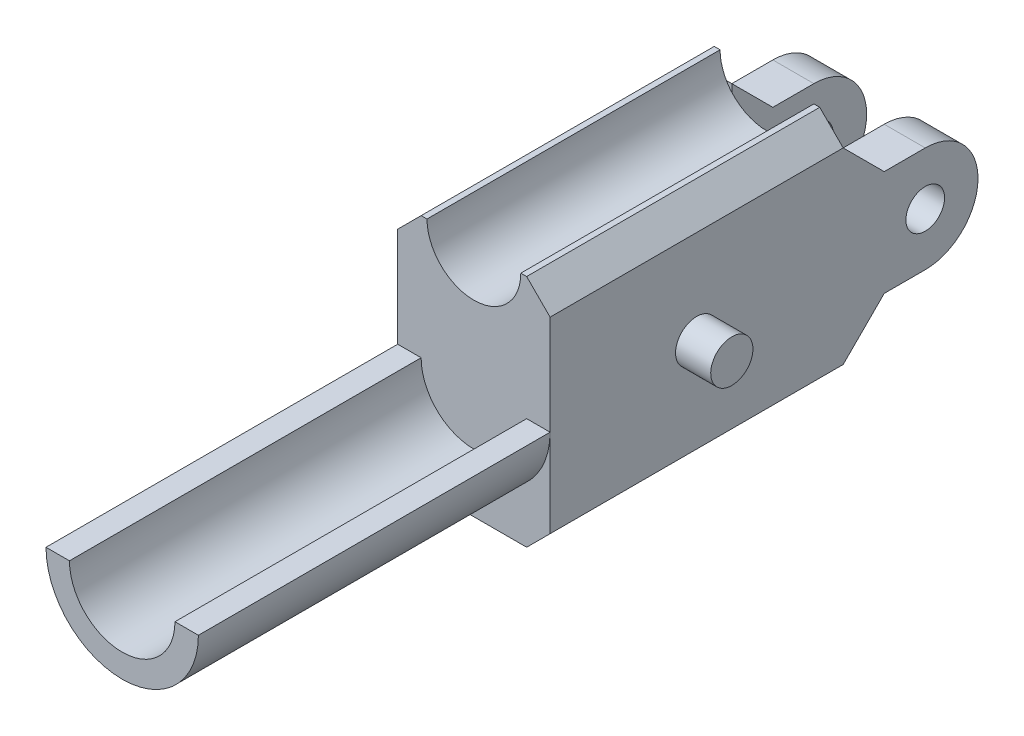
ISO-10303-21;
HEADER;
FILE_DESCRIPTION(('STEP AP214'),'2;1');
FILE_NAME('part.step','',(''),(''),'','','');
FILE_SCHEMA(('AUTOMOTIVE_DESIGN { 1 0 10303 214 1 1 1 1 }'));
ENDSEC;
DATA;
#1=APPLICATION_CONTEXT('core data for automotive mechanical design processes');
#2=APPLICATION_PROTOCOL_DEFINITION('international standard','automotive_design',2000,#1);
#3=PRODUCT_CONTEXT('',#1,'mechanical');
#4=PRODUCT('Part','Part','',(#3));
#5=PRODUCT_RELATED_PRODUCT_CATEGORY('part','',(#4));
#6=PRODUCT_DEFINITION_FORMATION('','',#4);
#7=PRODUCT_DEFINITION_CONTEXT('part definition',#1,'design');
#8=PRODUCT_DEFINITION('design','',#6,#7);
#9=PRODUCT_DEFINITION_SHAPE('','',#8);
#10=(LENGTH_UNIT() NAMED_UNIT(*) SI_UNIT(.MILLI.,.METRE.));
#11=(NAMED_UNIT(*) PLANE_ANGLE_UNIT() SI_UNIT($,.RADIAN.));
#12=(NAMED_UNIT(*) SI_UNIT($,.STERADIAN.) SOLID_ANGLE_UNIT());
#13=UNCERTAINTY_MEASURE_WITH_UNIT(LENGTH_MEASURE(1.E-05),#10,'distance_accuracy_value','');
#14=(GEOMETRIC_REPRESENTATION_CONTEXT(3) GLOBAL_UNCERTAINTY_ASSIGNED_CONTEXT((#13)) GLOBAL_UNIT_ASSIGNED_CONTEXT((#10,
#11,#12)) REPRESENTATION_CONTEXT('',''));
#15=CARTESIAN_POINT('',(0.,0.,0.));
#16=DIRECTION('',(0.,0.,1.));
#17=DIRECTION('',(1.,0.,0.));
#18=AXIS2_PLACEMENT_3D('',#15,#16,#17);
#19=CARTESIAN_POINT('',(-26.204060495238,5.00000000000001,-32.));
#20=DIRECTION('',(0.,1.,0.));
#21=DIRECTION('',(0.,0.,1.));
#22=AXIS2_PLACEMENT_3D('',#19,#20,#21);
#23=PLANE('',#22);
#24=DIRECTION('',(0.,0.,1.));
#25=VECTOR('',#24,1.);
#26=CARTESIAN_POINT('',(-3.,5.00000000000001,-32.));
#27=LINE('',#26,#25);
#28=CARTESIAN_POINT('',(-3.,5.00000000000001,-32.));
#29=VERTEX_POINT('',#28);
#30=CARTESIAN_POINT('',(-3.,5.00000000000001,-28.5));
#31=VERTEX_POINT('',#30);
#32=EDGE_CURVE('E396',#29,#31,#27,.T.);
#33=ORIENTED_EDGE('',*,*,#32,.F.);
#34=DIRECTION('',(1.,0.,0.));
#35=VECTOR('',#34,1.);
#36=CARTESIAN_POINT('',(-26.204060495238,5.00000000000001,-32.));
#37=LINE('',#36,#35);
#38=CARTESIAN_POINT('',(-6.49999999999999,5.00000000000001,-32.));
#39=VERTEX_POINT('',#38);
#40=EDGE_CURVE('E253',#39,#29,#37,.T.);
#41=ORIENTED_EDGE('',*,*,#40,.F.);
#42=DIRECTION('',(0.,0.,-1.));
#43=VECTOR('',#42,1.);
#44=CARTESIAN_POINT('',(-6.49999999999999,5.00000000000001,-32.));
#45=LINE('',#44,#43);
#46=CARTESIAN_POINT('',(-6.49999999999999,5.00000000000001,-28.5));
#47=VERTEX_POINT('',#46);
#48=EDGE_CURVE('E261',#47,#39,#45,.T.);
#49=ORIENTED_EDGE('',*,*,#48,.F.);
#50=DIRECTION('',(1.,0.,0.));
#51=VECTOR('',#50,1.);
#52=CARTESIAN_POINT('',(-26.204060495238,5.00000000000001,-28.5));
#53=LINE('',#52,#51);
#54=EDGE_CURVE('E249',#47,#31,#53,.T.);
#55=ORIENTED_EDGE('',*,*,#54,.T.);
#56=EDGE_LOOP('',(#33,#41,#49,#55));
#57=FACE_BOUND('',#56,.T.);
#58=ADVANCED_FACE('F35',(#57),#23,.T.);
#59=CARTESIAN_POINT('',(-26.204060495238,5.00000000000001,-28.5));
#60=DIRECTION('',(0.,0.707106781186546,-0.707106781186548));
#61=DIRECTION('',(0.,0.707106781186549,0.707106781186546));
#62=AXIS2_PLACEMENT_3D('',#59,#60,#61);
#63=PLANE('',#62);
#64=DIRECTION('',(0.,0.707106781186549,0.707106781186546));
#65=VECTOR('',#64,1.);
#66=CARTESIAN_POINT('',(-3.,5.00000000000001,-28.5));
#67=LINE('',#66,#65);
#68=CARTESIAN_POINT('',(-3.,8.50000000000001,-25.));
#69=VERTEX_POINT('',#68);
#70=EDGE_CURVE('E398',#31,#69,#67,.T.);
#71=ORIENTED_EDGE('',*,*,#70,.F.);
#72=ORIENTED_EDGE('',*,*,#54,.F.);
#73=DIRECTION('',(0.,-0.707106781186549,-0.707106781186546));
#74=VECTOR('',#73,1.);
#75=CARTESIAN_POINT('',(-6.49999999999999,5.,-28.5));
#76=LINE('',#75,#74);
#77=CARTESIAN_POINT('',(-6.49999999999999,8.5,-25.));
#78=VERTEX_POINT('',#77);
#79=EDGE_CURVE('E404',#78,#47,#76,.T.);
#80=ORIENTED_EDGE('',*,*,#79,.F.);
#81=DIRECTION('',(1.,0.,0.));
#82=VECTOR('',#81,1.);
#83=CARTESIAN_POINT('',(-26.204060495238,8.50000000000001,-25.));
#84=LINE('',#83,#82);
#85=CARTESIAN_POINT('',(-3.46410161513776,8.50000000000001,-25.));
#86=VERTEX_POINT('',#85);
#87=EDGE_CURVE('E47',#78,#86,#84,.T.);
#88=ORIENTED_EDGE('',*,*,#87,.T.);
#89=EDGE_CURVE('E48',#86,#69,#84,.T.);
#90=ORIENTED_EDGE('',*,*,#89,.T.);
#91=EDGE_LOOP('',(#71,#72,#80,#88,#90));
#92=FACE_BOUND('',#91,.T.);
#93=ADVANCED_FACE('F467',(#92),#63,.T.);
#94=CARTESIAN_POINT('',(-26.204060495238,8.50000000000001,-25.));
#95=DIRECTION('',(0.,0.,1.));
#96=DIRECTION('',(1.,0.,0.));
#97=AXIS2_PLACEMENT_3D('',#94,#95,#96);
#98=PLANE('',#97);
#99=DIRECTION('',(0.,1.,0.));
#100=VECTOR('',#99,1.);
#101=CARTESIAN_POINT('',(-3.,-9.50000000000001,-25.));
#102=LINE('',#101,#100);
#103=CARTESIAN_POINT('',(-3.,7.85424868893541,-25.));
#104=VERTEX_POINT('',#103);
#105=EDGE_CURVE('E384',#104,#69,#102,.T.);
#106=ORIENTED_EDGE('',*,*,#105,.T.);
#107=ORIENTED_EDGE('',*,*,#89,.F.);
#108=CARTESIAN_POINT('',(0.,10.5,-25.));
#109=DIRECTION('',(0.,0.,1.));
#110=DIRECTION('',(1.,0.,0.));
#111=AXIS2_PLACEMENT_3D('',#108,#109,#110);
#112=CIRCLE('',#111,4.);
#113=EDGE_CURVE('E375',#86,#104,#112,.T.);
#114=ORIENTED_EDGE('',*,*,#113,.T.);
#115=EDGE_LOOP('',(#106,#107,#114));
#116=FACE_BOUND('',#115,.T.);
#117=ADVANCED_FACE('F475',(#116),#98,.T.);
#118=CARTESIAN_POINT('',(-26.204060495238,-3.99999999999999,-28.5));
#119=DIRECTION('',(0.,-0.707106781186546,-0.707106781186549));
#120=DIRECTION('',(0.,0.707106781186549,-0.707106781186546));
#121=AXIS2_PLACEMENT_3D('',#118,#119,#120);
#122=PLANE('',#121);
#123=DIRECTION('',(0.,0.707106781186549,-0.707106781186546));
#124=VECTOR('',#123,1.);
#125=CARTESIAN_POINT('',(-3.,-3.99999999999999,-28.5));
#126=LINE('',#125,#124);
#127=CARTESIAN_POINT('',(-3.,-7.49999999999998,-25.));
#128=VERTEX_POINT('',#127);
#129=CARTESIAN_POINT('',(-3.,-3.99999999999999,-28.5));
#130=VERTEX_POINT('',#129);
#131=EDGE_CURVE('E394',#128,#130,#126,.T.);
#132=ORIENTED_EDGE('',*,*,#131,.F.);
#133=DIRECTION('',(1.,0.,0.));
#134=VECTOR('',#133,1.);
#135=CARTESIAN_POINT('',(-26.204060495238,-7.49999999999999,-25.));
#136=LINE('',#135,#134);
#137=CARTESIAN_POINT('',(-6.5,-7.50000000000001,-25.));
#138=VERTEX_POINT('',#137);
#139=EDGE_CURVE('E239',#138,#128,#136,.T.);
#140=ORIENTED_EDGE('',*,*,#139,.F.);
#141=DIRECTION('',(0.,-0.707106781186549,0.707106781186546));
#142=VECTOR('',#141,1.);
#143=CARTESIAN_POINT('',(-6.5,-3.99999999999999,-28.5));
#144=LINE('',#143,#142);
#145=CARTESIAN_POINT('',(-6.5,-3.99999999999999,-28.5));
#146=VERTEX_POINT('',#145);
#147=EDGE_CURVE('E406',#146,#138,#144,.T.);
#148=ORIENTED_EDGE('',*,*,#147,.F.);
#149=DIRECTION('',(1.,0.,0.));
#150=VECTOR('',#149,1.);
#151=CARTESIAN_POINT('',(-26.204060495238,-3.99999999999999,-28.5));
#152=LINE('',#151,#150);
#153=EDGE_CURVE('E246',#146,#130,#152,.T.);
#154=ORIENTED_EDGE('',*,*,#153,.T.);
#155=EDGE_LOOP('',(#132,#140,#148,#154));
#156=FACE_BOUND('',#155,.T.);
#157=ADVANCED_FACE('F463',(#156),#122,.T.);
#158=CARTESIAN_POINT('',(-26.204060495238,-3.99999999999999,-32.));
#159=DIRECTION('',(0.,-1.,0.));
#160=DIRECTION('',(0.,0.,-1.));
#161=AXIS2_PLACEMENT_3D('',#158,#159,#160);
#162=PLANE('',#161);
#163=DIRECTION('',(0.,0.,-1.));
#164=VECTOR('',#163,1.);
#165=CARTESIAN_POINT('',(-3.,-3.99999999999999,-32.));
#166=LINE('',#165,#164);
#167=CARTESIAN_POINT('',(-3.,-3.99999999999999,-32.));
#168=VERTEX_POINT('',#167);
#169=EDGE_CURVE('E391',#130,#168,#166,.T.);
#170=ORIENTED_EDGE('',*,*,#169,.F.);
#171=ORIENTED_EDGE('',*,*,#153,.F.);
#172=DIRECTION('',(0.,0.,1.));
#173=VECTOR('',#172,1.);
#174=CARTESIAN_POINT('',(-6.5,-3.99999999999999,-32.));
#175=LINE('',#174,#173);
#176=CARTESIAN_POINT('',(-6.5,-3.99999999999999,-32.));
#177=VERTEX_POINT('',#176);
#178=EDGE_CURVE('E410',#177,#146,#175,.T.);
#179=ORIENTED_EDGE('',*,*,#178,.F.);
#180=DIRECTION('',(1.,0.,0.));
#181=VECTOR('',#180,1.);
#182=CARTESIAN_POINT('',(-26.204060495238,-3.99999999999999,-32.));
#183=LINE('',#182,#181);
#184=EDGE_CURVE('E407',#177,#168,#183,.T.);
#185=ORIENTED_EDGE('',*,*,#184,.T.);
#186=EDGE_LOOP('',(#170,#171,#179,#185));
#187=FACE_BOUND('',#186,.T.);
#188=ADVANCED_FACE('F452',(#187),#162,.T.);
#189=CARTESIAN_POINT('',(-26.204060495238,0.50000000000001,-32.));
#190=DIRECTION('',(1.,0.,0.));
#191=DIRECTION('',(0.,1.,0.));
#192=AXIS2_PLACEMENT_3D('',#189,#190,#191);
#193=CYLINDRICAL_SURFACE('',#192,4.5);
#194=CARTESIAN_POINT('',(-3.,0.500000000000009,-32.));
#195=DIRECTION('',(-1.,0.,0.));
#196=DIRECTION('',(0.,-1.,0.));
#197=AXIS2_PLACEMENT_3D('',#194,#195,#196);
#198=CIRCLE('',#197,4.5);
#199=EDGE_CURVE('E389',#168,#29,#198,.F.);
#200=ORIENTED_EDGE('',*,*,#199,.F.);
#201=ORIENTED_EDGE('',*,*,#184,.F.);
#202=CARTESIAN_POINT('',(-6.5,0.500000000000009,-32.));
#203=DIRECTION('',(1.,0.,0.));
#204=DIRECTION('',(0.,1.,0.));
#205=AXIS2_PLACEMENT_3D('',#202,#203,#204);
#206=CIRCLE('',#205,4.5);
#207=EDGE_CURVE('E403',#39,#177,#206,.F.);
#208=ORIENTED_EDGE('',*,*,#207,.F.);
#209=ORIENTED_EDGE('',*,*,#40,.T.);
#210=EDGE_LOOP('',(#200,#201,#208,#209));
#211=FACE_BOUND('',#210,.T.);
#212=ADVANCED_FACE('F460',(#211),#193,.T.);
#213=CARTESIAN_POINT('',(-26.204060495238,0.50000000000001,-32.));
#214=DIRECTION('',(1.,0.,0.));
#215=DIRECTION('',(0.,1.,0.));
#216=AXIS2_PLACEMENT_3D('',#213,#214,#215);
#217=CYLINDRICAL_SURFACE('',#216,1.65);
#218=CARTESIAN_POINT('',(-3.,0.500000000000009,-32.));
#219=DIRECTION('',(-1.,0.,0.));
#220=DIRECTION('',(0.,-1.,0.));
#221=AXIS2_PLACEMENT_3D('',#218,#219,#220);
#222=CIRCLE('',#221,1.65);
#223=CARTESIAN_POINT('',(-3.,-1.14999999999999,-32.));
#224=VERTEX_POINT('',#223);
#225=EDGE_CURVE('E40',#224,#224,#222,.F.);
#226=ORIENTED_EDGE('',*,*,#225,.T.);
#227=EDGE_LOOP('',(#226));
#228=FACE_BOUND('',#227,.T.);
#229=CARTESIAN_POINT('',(-6.5,0.500000000000009,-32.));
#230=DIRECTION('',(1.,0.,0.));
#231=DIRECTION('',(0.,1.,0.));
#232=AXIS2_PLACEMENT_3D('',#229,#230,#231);
#233=CIRCLE('',#232,1.65);
#234=CARTESIAN_POINT('',(-6.49999999999999,2.15000000000001,-32.));
#235=VERTEX_POINT('',#234);
#236=EDGE_CURVE('E257',#235,#235,#233,.F.);
#237=ORIENTED_EDGE('',*,*,#236,.T.);
#238=EDGE_LOOP('',(#237));
#239=FACE_BOUND('',#238,.T.);
#240=ADVANCED_FACE('F617',(#228,#239),#217,.F.);
#241=CARTESIAN_POINT('',(0.,0.,-25.));
#242=DIRECTION('',(0.,0.,1.));
#243=DIRECTION('',(1.,0.,0.));
#244=AXIS2_PLACEMENT_3D('',#241,#242,#243);
#245=PLANE('',#244);
#246=ORIENTED_EDGE('',*,*,#87,.F.);
#247=DIRECTION('',(-0.707106781186546,-0.707106781186549,0.));
#248=VECTOR('',#247,1.);
#249=CARTESIAN_POINT('',(-4.49999999999999,10.5,-25.));
#250=LINE('',#249,#248);
#251=CARTESIAN_POINT('',(-4.5,10.5,-25.));
#252=VERTEX_POINT('',#251);
#253=EDGE_CURVE('E350',#78,#252,#250,.F.);
#254=ORIENTED_EDGE('',*,*,#253,.T.);
#255=DIRECTION('',(1.,0.,0.));
#256=VECTOR('',#255,1.);
#257=CARTESIAN_POINT('',(-6.49999999999999,10.5,-25.));
#258=LINE('',#257,#256);
#259=CARTESIAN_POINT('',(-4.,10.5,-25.));
#260=VERTEX_POINT('',#259);
#261=EDGE_CURVE('E283',#252,#260,#258,.T.);
#262=ORIENTED_EDGE('',*,*,#261,.T.);
#263=EDGE_CURVE('E372',#260,#86,#112,.T.);
#264=ORIENTED_EDGE('',*,*,#263,.T.);
#265=EDGE_LOOP('',(#246,#254,#262,#264));
#266=FACE_BOUND('',#265,.T.);
#267=ADVANCED_FACE('F615',(#266),#245,.F.);
#268=CARTESIAN_POINT('',(3.46410161513776,8.50000000000001,-25.));
#269=VERTEX_POINT('',#268);
#270=CARTESIAN_POINT('',(6.5,8.50000000000001,-25.));
#271=VERTEX_POINT('',#270);
#272=EDGE_CURVE('E11',#269,#271,#84,.T.);
#273=ORIENTED_EDGE('',*,*,#272,.F.);
#274=CARTESIAN_POINT('',(4.,10.5,-25.));
#275=VERTEX_POINT('',#274);
#276=EDGE_CURVE('E371',#269,#275,#112,.T.);
#277=ORIENTED_EDGE('',*,*,#276,.T.);
#278=CARTESIAN_POINT('',(4.50000000000001,10.5,-25.));
#279=VERTEX_POINT('',#278);
#280=EDGE_CURVE('E281',#275,#279,#258,.T.);
#281=ORIENTED_EDGE('',*,*,#280,.T.);
#282=DIRECTION('',(-0.707106781186549,0.707106781186546,0.));
#283=VECTOR('',#282,1.);
#284=CARTESIAN_POINT('',(6.5,8.50000000000001,-25.));
#285=LINE('',#284,#283);
#286=EDGE_CURVE('E352',#279,#271,#285,.F.);
#287=ORIENTED_EDGE('',*,*,#286,.T.);
#288=EDGE_LOOP('',(#273,#277,#281,#287));
#289=FACE_BOUND('',#288,.T.);
#290=ADVANCED_FACE('F604',(#289),#245,.F.);
#291=CARTESIAN_POINT('',(-6.49999999999999,10.5,-25.));
#292=DIRECTION('',(0.,-1.,0.));
#293=DIRECTION('',(1.,0.,0.));
#294=AXIS2_PLACEMENT_3D('',#291,#292,#293);
#295=PLANE('',#294);
#296=DIRECTION('',(1.,0.,0.));
#297=VECTOR('',#296,1.);
#298=CARTESIAN_POINT('',(-6.49999999999999,10.5,0.));
#299=LINE('',#298,#297);
#300=CARTESIAN_POINT('',(-4.5,10.5,0.));
#301=VERTEX_POINT('',#300);
#302=CARTESIAN_POINT('',(-4.,10.5,0.));
#303=VERTEX_POINT('',#302);
#304=EDGE_CURVE('E282',#301,#303,#299,.T.);
#305=ORIENTED_EDGE('',*,*,#304,.T.);
#306=DIRECTION('',(0.,0.,-1.));
#307=VECTOR('',#306,1.);
#308=CARTESIAN_POINT('',(-4.,10.5,15.));
#309=LINE('',#308,#307);
#310=EDGE_CURVE('E275',#303,#260,#309,.T.);
#311=ORIENTED_EDGE('',*,*,#310,.T.);
#312=ORIENTED_EDGE('',*,*,#261,.F.);
#313=DIRECTION('',(0.,0.,1.));
#314=VECTOR('',#313,1.);
#315=CARTESIAN_POINT('',(-4.5,10.5,-25.));
#316=LINE('',#315,#314);
#317=EDGE_CURVE('E340',#252,#301,#316,.T.);
#318=ORIENTED_EDGE('',*,*,#317,.T.);
#319=EDGE_LOOP('',(#305,#311,#312,#318));
#320=FACE_BOUND('',#319,.T.);
#321=ADVANCED_FACE('F549',(#320),#295,.F.);
#322=CARTESIAN_POINT('',(0.,0.,30.));
#323=DIRECTION('',(0.,0.,-1.));
#324=DIRECTION('',(-1.,0.,0.));
#325=AXIS2_PLACEMENT_3D('',#322,#323,#324);
#326=CYLINDRICAL_SURFACE('',#325,6.5);
#327=CARTESIAN_POINT('',(0.,0.,0.));
#328=DIRECTION('',(0.,0.,1.));
#329=DIRECTION('',(-1.,0.,0.));
#330=AXIS2_PLACEMENT_3D('',#327,#328,#329);
#331=CIRCLE('',#330,6.5);
#332=CARTESIAN_POINT('',(-6.49999999999999,0.,0.));
#333=VERTEX_POINT('',#332);
#334=CARTESIAN_POINT('',(6.5,0.,0.));
#335=VERTEX_POINT('',#334);
#336=EDGE_CURVE('E286',#333,#335,#331,.T.);
#337=ORIENTED_EDGE('',*,*,#336,.T.);
#338=DIRECTION('',(0.,0.,-1.));
#339=VECTOR('',#338,1.);
#340=CARTESIAN_POINT('',(6.5,0.,30.));
#341=LINE('',#340,#339);
#342=CARTESIAN_POINT('',(6.5,0.,30.));
#343=VERTEX_POINT('',#342);
#344=EDGE_CURVE('E327',#343,#335,#341,.T.);
#345=ORIENTED_EDGE('',*,*,#344,.F.);
#346=CARTESIAN_POINT('',(0.,0.,30.));
#347=DIRECTION('',(0.,0.,1.));
#348=DIRECTION('',(-1.,0.,0.));
#349=AXIS2_PLACEMENT_3D('',#346,#347,#348);
#350=CIRCLE('',#349,6.5);
#351=CARTESIAN_POINT('',(-6.5,0.,30.));
#352=VERTEX_POINT('',#351);
#353=EDGE_CURVE('E298',#352,#343,#350,.T.);
#354=ORIENTED_EDGE('',*,*,#353,.F.);
#355=DIRECTION('',(0.,0.,-1.));
#356=VECTOR('',#355,1.);
#357=CARTESIAN_POINT('',(-6.5,0.,30.));
#358=LINE('',#357,#356);
#359=EDGE_CURVE('E308',#352,#333,#358,.T.);
#360=ORIENTED_EDGE('',*,*,#359,.T.);
#361=EDGE_LOOP('',(#337,#345,#354,#360));
#362=FACE_BOUND('',#361,.T.);
#363=ADVANCED_FACE('F520',(#362),#326,.T.);
#364=CARTESIAN_POINT('',(6.5,0.,30.));
#365=DIRECTION('',(0.,-1.,0.));
#366=DIRECTION('',(1.,0.,0.));
#367=AXIS2_PLACEMENT_3D('',#364,#365,#366);
#368=PLANE('',#367);
#369=DIRECTION('',(-1.,0.,0.));
#370=VECTOR('',#369,1.);
#371=CARTESIAN_POINT('',(6.5,0.,0.));
#372=LINE('',#371,#370);
#373=CARTESIAN_POINT('',(4.5,0.,0.));
#374=VERTEX_POINT('',#373);
#375=EDGE_CURVE('E311',#335,#374,#372,.T.);
#376=ORIENTED_EDGE('',*,*,#375,.T.);
#377=DIRECTION('',(0.,0.,-1.));
#378=VECTOR('',#377,1.);
#379=CARTESIAN_POINT('',(4.5,0.,30.));
#380=LINE('',#379,#378);
#381=CARTESIAN_POINT('',(4.5,0.,30.));
#382=VERTEX_POINT('',#381);
#383=EDGE_CURVE('E324',#382,#374,#380,.T.);
#384=ORIENTED_EDGE('',*,*,#383,.F.);
#385=DIRECTION('',(-1.,0.,0.));
#386=VECTOR('',#385,1.);
#387=CARTESIAN_POINT('',(6.5,0.,30.));
#388=LINE('',#387,#386);
#389=EDGE_CURVE('E301',#343,#382,#388,.T.);
#390=ORIENTED_EDGE('',*,*,#389,.F.);
#391=ORIENTED_EDGE('',*,*,#344,.T.);
#392=EDGE_LOOP('',(#376,#384,#390,#391));
#393=FACE_BOUND('',#392,.T.);
#394=ADVANCED_FACE('F517',(#393),#368,.F.);
#395=CARTESIAN_POINT('',(0.,0.,30.));
#396=DIRECTION('',(0.,0.,-1.));
#397=DIRECTION('',(-1.,0.,0.));
#398=AXIS2_PLACEMENT_3D('',#395,#396,#397);
#399=CYLINDRICAL_SURFACE('',#398,4.5);
#400=CARTESIAN_POINT('',(0.,0.,0.));
#401=DIRECTION('',(0.,0.,-1.));
#402=DIRECTION('',(-1.,0.,0.));
#403=AXIS2_PLACEMENT_3D('',#400,#401,#402);
#404=CIRCLE('',#403,4.5);
#405=CARTESIAN_POINT('',(-4.5,0.,0.));
#406=VERTEX_POINT('',#405);
#407=EDGE_CURVE('E314',#374,#406,#404,.T.);
#408=ORIENTED_EDGE('',*,*,#407,.T.);
#409=DIRECTION('',(0.,0.,-1.));
#410=VECTOR('',#409,1.);
#411=CARTESIAN_POINT('',(-4.5,0.,30.));
#412=LINE('',#411,#410);
#413=CARTESIAN_POINT('',(-4.5,0.,30.));
#414=VERTEX_POINT('',#413);
#415=EDGE_CURVE('E321',#414,#406,#412,.T.);
#416=ORIENTED_EDGE('',*,*,#415,.F.);
#417=CARTESIAN_POINT('',(0.,0.,30.));
#418=DIRECTION('',(0.,0.,-1.));
#419=DIRECTION('',(-1.,0.,0.));
#420=AXIS2_PLACEMENT_3D('',#417,#418,#419);
#421=CIRCLE('',#420,4.5);
#422=EDGE_CURVE('E304',#382,#414,#421,.T.);
#423=ORIENTED_EDGE('',*,*,#422,.F.);
#424=ORIENTED_EDGE('',*,*,#383,.T.);
#425=EDGE_LOOP('',(#408,#416,#423,#424));
#426=FACE_BOUND('',#425,.T.);
#427=ADVANCED_FACE('F528',(#426),#399,.F.);
#428=CARTESIAN_POINT('',(-6.5,0.,30.));
#429=DIRECTION('',(0.,-1.,0.));
#430=DIRECTION('',(1.,0.,0.));
#431=AXIS2_PLACEMENT_3D('',#428,#429,#430);
#432=PLANE('',#431);
#433=DIRECTION('',(-1.,0.,0.));
#434=VECTOR('',#433,1.);
#435=CARTESIAN_POINT('',(-6.5,0.,0.));
#436=LINE('',#435,#434);
#437=EDGE_CURVE('E302',#406,#333,#436,.T.);
#438=ORIENTED_EDGE('',*,*,#437,.T.);
#439=ORIENTED_EDGE('',*,*,#359,.F.);
#440=DIRECTION('',(-1.,0.,0.));
#441=VECTOR('',#440,1.);
#442=CARTESIAN_POINT('',(-6.5,0.,30.));
#443=LINE('',#442,#441);
#444=EDGE_CURVE('E306',#414,#352,#443,.T.);
#445=ORIENTED_EDGE('',*,*,#444,.F.);
#446=ORIENTED_EDGE('',*,*,#415,.T.);
#447=EDGE_LOOP('',(#438,#439,#445,#446));
#448=FACE_BOUND('',#447,.T.);
#449=ADVANCED_FACE('F524',(#448),#432,.F.);
#450=CARTESIAN_POINT('',(0.,0.,30.));
#451=DIRECTION('',(0.,0.,-1.));
#452=DIRECTION('',(-1.,0.,0.));
#453=AXIS2_PLACEMENT_3D('',#450,#451,#452);
#454=PLANE('',#453);
#455=ORIENTED_EDGE('',*,*,#353,.T.);
#456=ORIENTED_EDGE('',*,*,#389,.T.);
#457=ORIENTED_EDGE('',*,*,#422,.T.);
#458=ORIENTED_EDGE('',*,*,#444,.T.);
#459=EDGE_LOOP('',(#455,#456,#457,#458));
#460=FACE_BOUND('',#459,.T.);
#461=ADVANCED_FACE('F531',(#460),#454,.F.);
#462=CARTESIAN_POINT('',(0.,0.,0.));
#463=DIRECTION('',(0.,0.,1.));
#464=DIRECTION('',(1.,0.,0.));
#465=AXIS2_PLACEMENT_3D('',#462,#463,#464);
#466=PLANE('',#465);
#467=DIRECTION('',(0.,1.,0.));
#468=VECTOR('',#467,1.);
#469=CARTESIAN_POINT('',(-6.49999999999999,10.5,0.));
#470=LINE('',#469,#468);
#471=CARTESIAN_POINT('',(-6.5,-7.50000000000001,0.));
#472=VERTEX_POINT('',#471);
#473=EDGE_CURVE('E293',#472,#333,#470,.T.);
#474=ORIENTED_EDGE('',*,*,#473,.F.);
#475=DIRECTION('',(-0.707106781186549,0.707106781186546,0.));
#476=VECTOR('',#475,1.);
#477=CARTESIAN_POINT('',(-6.99999999999999,-7.00000000000002,0.));
#478=LINE('',#477,#476);
#479=CARTESIAN_POINT('',(-4.5,-9.5,0.));
#480=VERTEX_POINT('',#479);
#481=EDGE_CURVE('E363',#472,#480,#478,.F.);
#482=ORIENTED_EDGE('',*,*,#481,.T.);
#483=DIRECTION('',(-1.,0.,0.));
#484=VECTOR('',#483,1.);
#485=CARTESIAN_POINT('',(-6.5,-9.5,0.));
#486=LINE('',#485,#484);
#487=CARTESIAN_POINT('',(4.5,-9.5,0.));
#488=VERTEX_POINT('',#487);
#489=EDGE_CURVE('E289',#488,#480,#486,.T.);
#490=ORIENTED_EDGE('',*,*,#489,.F.);
#491=DIRECTION('',(-0.707106781186546,-0.707106781186549,0.));
#492=VECTOR('',#491,1.);
#493=CARTESIAN_POINT('',(7.00000000000001,-6.99999999999998,0.));
#494=LINE('',#493,#492);
#495=CARTESIAN_POINT('',(6.5,-7.49999999999999,0.));
#496=VERTEX_POINT('',#495);
#497=EDGE_CURVE('E361',#488,#496,#494,.F.);
#498=ORIENTED_EDGE('',*,*,#497,.T.);
#499=DIRECTION('',(0.,-1.,0.));
#500=VECTOR('',#499,1.);
#501=CARTESIAN_POINT('',(6.5,10.5,0.));
#502=LINE('',#501,#500);
#503=EDGE_CURVE('E278',#335,#496,#502,.T.);
#504=ORIENTED_EDGE('',*,*,#503,.F.);
#505=ORIENTED_EDGE('',*,*,#336,.F.);
#506=EDGE_LOOP('',(#474,#482,#490,#498,#504,#505));
#507=FACE_BOUND('',#506,.T.);
#508=ADVANCED_FACE('F513',(#507),#466,.T.);
#509=CARTESIAN_POINT('',(0.,10.5,0.));
#510=DIRECTION('',(0.,0.,1.));
#511=DIRECTION('',(1.,0.,0.));
#512=AXIS2_PLACEMENT_3D('',#509,#510,#511);
#513=CIRCLE('',#512,4.);
#514=CARTESIAN_POINT('',(4.,10.5,0.));
#515=VERTEX_POINT('',#514);
#516=EDGE_CURVE('E273',#303,#515,#513,.T.);
#517=ORIENTED_EDGE('',*,*,#516,.F.);
#518=ORIENTED_EDGE('',*,*,#304,.F.);
#519=DIRECTION('',(0.707106781186546,0.707106781186549,0.));
#520=VECTOR('',#519,1.);
#521=CARTESIAN_POINT('',(-7.50000000000001,7.49999999999998,0.));
#522=LINE('',#521,#520);
#523=CARTESIAN_POINT('',(-6.49999999999999,8.5,0.));
#524=VERTEX_POINT('',#523);
#525=EDGE_CURVE('E335',#301,#524,#522,.F.);
#526=ORIENTED_EDGE('',*,*,#525,.T.);
#527=EDGE_CURVE('E292',#333,#524,#470,.T.);
#528=ORIENTED_EDGE('',*,*,#527,.F.);
#529=ORIENTED_EDGE('',*,*,#437,.F.);
#530=ORIENTED_EDGE('',*,*,#407,.F.);
#531=ORIENTED_EDGE('',*,*,#375,.F.);
#532=CARTESIAN_POINT('',(6.5,8.50000000000001,0.));
#533=VERTEX_POINT('',#532);
#534=EDGE_CURVE('E287',#533,#335,#502,.T.);
#535=ORIENTED_EDGE('',*,*,#534,.F.);
#536=DIRECTION('',(0.707106781186549,-0.707106781186546,0.));
#537=VECTOR('',#536,1.);
#538=CARTESIAN_POINT('',(7.5,7.50000000000002,0.));
#539=LINE('',#538,#537);
#540=CARTESIAN_POINT('',(4.50000000000001,10.5,0.));
#541=VERTEX_POINT('',#540);
#542=EDGE_CURVE('E337',#533,#541,#539,.F.);
#543=ORIENTED_EDGE('',*,*,#542,.T.);
#544=EDGE_CURVE('E295',#515,#541,#299,.T.);
#545=ORIENTED_EDGE('',*,*,#544,.F.);
#546=EDGE_LOOP('',(#517,#518,#526,#528,#529,#530,#531,#535,#543,#545));
#547=FACE_BOUND('',#546,.T.);
#548=ADVANCED_FACE('F504',(#547),#466,.T.);
#549=CARTESIAN_POINT('',(6.5,10.5,-25.));
#550=DIRECTION('',(-1.,0.,0.));
#551=DIRECTION('',(0.,-1.,0.));
#552=AXIS2_PLACEMENT_3D('',#549,#550,#551);
#553=PLANE('',#552);
#554=CARTESIAN_POINT('',(6.5,0.500000000000009,-12.5));
#555=DIRECTION('',(-1.,0.,0.));
#556=DIRECTION('',(0.,-1.,0.));
#557=AXIS2_PLACEMENT_3D('',#554,#555,#556);
#558=CIRCLE('',#557,1.8);
#559=CARTESIAN_POINT('',(6.5,-1.29999999999999,-12.5));
#560=VERTEX_POINT('',#559);
#561=EDGE_CURVE('E45',#560,#560,#558,.F.);
#562=ORIENTED_EDGE('',*,*,#561,.F.);
#563=EDGE_LOOP('',(#562));
#564=FACE_BOUND('',#563,.T.);
#565=DIRECTION('',(0.,0.,-1.));
#566=VECTOR('',#565,1.);
#567=CARTESIAN_POINT('',(6.5,-7.49999999999999,-25.));
#568=LINE('',#567,#566);
#569=CARTESIAN_POINT('',(6.5,-7.49999999999999,-25.));
#570=VERTEX_POINT('',#569);
#571=EDGE_CURVE('E330',#496,#570,#568,.T.);
#572=ORIENTED_EDGE('',*,*,#571,.T.);
#573=DIRECTION('',(0.,0.707106781186549,-0.707106781186546));
#574=VECTOR('',#573,1.);
#575=CARTESIAN_POINT('',(6.5,-3.99999999999999,-28.5));
#576=LINE('',#575,#574);
#577=CARTESIAN_POINT('',(6.5,-3.99999999999999,-28.5));
#578=VERTEX_POINT('',#577);
#579=EDGE_CURVE('E238',#570,#578,#576,.T.);
#580=ORIENTED_EDGE('',*,*,#579,.T.);
#581=DIRECTION('',(0.,0.,-1.));
#582=VECTOR('',#581,1.);
#583=CARTESIAN_POINT('',(6.5,-3.99999999999999,-32.));
#584=LINE('',#583,#582);
#585=CARTESIAN_POINT('',(6.5,-3.99999999999999,-32.));
#586=VERTEX_POINT('',#585);
#587=EDGE_CURVE('E425',#578,#586,#584,.T.);
#588=ORIENTED_EDGE('',*,*,#587,.T.);
#589=CARTESIAN_POINT('',(6.5,0.500000000000009,-32.));
#590=DIRECTION('',(1.,0.,0.));
#591=DIRECTION('',(0.,1.,0.));
#592=AXIS2_PLACEMENT_3D('',#589,#590,#591);
#593=CIRCLE('',#592,4.5);
#594=CARTESIAN_POINT('',(6.5,5.00000000000001,-32.));
#595=VERTEX_POINT('',#594);
#596=EDGE_CURVE('E415',#586,#595,#593,.T.);
#597=ORIENTED_EDGE('',*,*,#596,.T.);
#598=DIRECTION('',(0.,0.,1.));
#599=VECTOR('',#598,1.);
#600=CARTESIAN_POINT('',(6.5,5.00000000000001,-32.));
#601=LINE('',#600,#599);
#602=CARTESIAN_POINT('',(6.5,5.00000000000001,-28.5));
#603=VERTEX_POINT('',#602);
#604=EDGE_CURVE('E418',#595,#603,#601,.T.);
#605=ORIENTED_EDGE('',*,*,#604,.T.);
#606=DIRECTION('',(0.,0.707106781186548,0.707106781186546));
#607=VECTOR('',#606,1.);
#608=CARTESIAN_POINT('',(6.5,5.00000000000001,-28.5));
#609=LINE('',#608,#607);
#610=EDGE_CURVE('E421',#603,#271,#609,.T.);
#611=ORIENTED_EDGE('',*,*,#610,.T.);
#612=DIRECTION('',(0.,0.,1.));
#613=VECTOR('',#612,1.);
#614=CARTESIAN_POINT('',(6.5,8.50000000000001,-25.));
#615=LINE('',#614,#613);
#616=EDGE_CURVE('E332',#271,#533,#615,.T.);
#617=ORIENTED_EDGE('',*,*,#616,.T.);
#618=ORIENTED_EDGE('',*,*,#534,.T.);
#619=ORIENTED_EDGE('',*,*,#503,.T.);
#620=EDGE_LOOP('',(#572,#580,#588,#597,#605,#611,#617,#618,#619));
#621=FACE_BOUND('',#620,.T.);
#622=CARTESIAN_POINT('',(6.5,0.500000000000009,-32.));
#623=DIRECTION('',(1.,0.,0.));
#624=DIRECTION('',(0.,1.,0.));
#625=AXIS2_PLACEMENT_3D('',#622,#623,#624);
#626=CIRCLE('',#625,1.65);
#627=CARTESIAN_POINT('',(6.5,2.15000000000001,-32.));
#628=VERTEX_POINT('',#627);
#629=EDGE_CURVE('E401',#628,#628,#626,.T.);
#630=ORIENTED_EDGE('',*,*,#629,.F.);
#631=EDGE_LOOP('',(#630));
#632=FACE_BOUND('',#631,.T.);
#633=ADVANCED_FACE('F443',(#564,#621,#632),#553,.F.);
#634=CARTESIAN_POINT('',(-6.5,-9.5,-25.));
#635=DIRECTION('',(0.,1.,0.));
#636=DIRECTION('',(-1.,0.,0.));
#637=AXIS2_PLACEMENT_3D('',#634,#635,#636);
#638=PLANE('',#637);
#639=ORIENTED_EDGE('',*,*,#489,.T.);
#640=DIRECTION('',(0.,0.,-1.));
#641=VECTOR('',#640,1.);
#642=CARTESIAN_POINT('',(-4.5,-9.5,-25.));
#643=LINE('',#642,#641);
#644=CARTESIAN_POINT('',(-4.5,-9.5,-25.));
#645=VERTEX_POINT('',#644);
#646=EDGE_CURVE('E368',#480,#645,#643,.T.);
#647=ORIENTED_EDGE('',*,*,#646,.T.);
#648=DIRECTION('',(-1.,0.,0.));
#649=VECTOR('',#648,1.);
#650=CARTESIAN_POINT('',(-6.5,-9.5,-25.));
#651=LINE('',#650,#649);
#652=CARTESIAN_POINT('',(4.5,-9.5,-25.));
#653=VERTEX_POINT('',#652);
#654=EDGE_CURVE('E279',#653,#645,#651,.T.);
#655=ORIENTED_EDGE('',*,*,#654,.F.);
#656=DIRECTION('',(0.,0.,1.));
#657=VECTOR('',#656,1.);
#658=CARTESIAN_POINT('',(4.5,-9.5,-25.));
#659=LINE('',#658,#657);
#660=EDGE_CURVE('E365',#653,#488,#659,.T.);
#661=ORIENTED_EDGE('',*,*,#660,.T.);
#662=EDGE_LOOP('',(#639,#647,#655,#661));
#663=FACE_BOUND('',#662,.T.);
#664=ADVANCED_FACE('F580',(#663),#638,.F.);
#665=CARTESIAN_POINT('',(-6.49999999999999,10.5,-25.));
#666=DIRECTION('',(1.,0.,0.));
#667=DIRECTION('',(0.,1.,0.));
#668=AXIS2_PLACEMENT_3D('',#665,#666,#667);
#669=PLANE('',#668);
#670=CARTESIAN_POINT('',(-6.49999999999999,0.500000000000009,-12.5));
#671=DIRECTION('',(1.,0.,0.));
#672=DIRECTION('',(0.,1.,0.));
#673=AXIS2_PLACEMENT_3D('',#670,#671,#672);
#674=CIRCLE('',#673,1.8);
#675=CARTESIAN_POINT('',(-6.49999999999999,2.30000000000001,-12.5));
#676=VERTEX_POINT('',#675);
#677=EDGE_CURVE('E270',#676,#676,#674,.F.);
#678=ORIENTED_EDGE('',*,*,#677,.F.);
#679=EDGE_LOOP('',(#678));
#680=FACE_BOUND('',#679,.T.);
#681=ORIENTED_EDGE('',*,*,#527,.T.);
#682=DIRECTION('',(0.,0.,-1.));
#683=VECTOR('',#682,1.);
#684=CARTESIAN_POINT('',(-6.49999999999999,8.5,-25.));
#685=LINE('',#684,#683);
#686=EDGE_CURVE('E358',#524,#78,#685,.T.);
#687=ORIENTED_EDGE('',*,*,#686,.T.);
#688=ORIENTED_EDGE('',*,*,#79,.T.);
#689=ORIENTED_EDGE('',*,*,#48,.T.);
#690=ORIENTED_EDGE('',*,*,#207,.T.);
#691=ORIENTED_EDGE('',*,*,#178,.T.);
#692=ORIENTED_EDGE('',*,*,#147,.T.);
#693=DIRECTION('',(0.,0.,1.));
#694=VECTOR('',#693,1.);
#695=CARTESIAN_POINT('',(-6.5,-7.50000000000001,-25.));
#696=LINE('',#695,#694);
#697=EDGE_CURVE('E355',#138,#472,#696,.T.);
#698=ORIENTED_EDGE('',*,*,#697,.T.);
#699=ORIENTED_EDGE('',*,*,#473,.T.);
#700=EDGE_LOOP('',(#681,#687,#688,#689,#690,#691,#692,#698,#699));
#701=FACE_BOUND('',#700,.T.);
#702=ORIENTED_EDGE('',*,*,#236,.F.);
#703=EDGE_LOOP('',(#702));
#704=FACE_BOUND('',#703,.T.);
#705=ADVANCED_FACE('F582',(#680,#701,#704),#669,.F.);
#706=ORIENTED_EDGE('',*,*,#280,.F.);
#707=DIRECTION('',(0.,0.,-1.));
#708=VECTOR('',#707,1.);
#709=CARTESIAN_POINT('',(4.,10.5,15.));
#710=LINE('',#709,#708);
#711=EDGE_CURVE('E265',#275,#515,#710,.F.);
#712=ORIENTED_EDGE('',*,*,#711,.T.);
#713=ORIENTED_EDGE('',*,*,#544,.T.);
#714=DIRECTION('',(0.,0.,-1.));
#715=VECTOR('',#714,1.);
#716=CARTESIAN_POINT('',(4.50000000000001,10.5,-25.));
#717=LINE('',#716,#715);
#718=EDGE_CURVE('E343',#541,#279,#717,.T.);
#719=ORIENTED_EDGE('',*,*,#718,.T.);
#720=EDGE_LOOP('',(#706,#712,#713,#719));
#721=FACE_BOUND('',#720,.T.);
#722=ADVANCED_FACE('F607',(#721),#295,.F.);
#723=ORIENTED_EDGE('',*,*,#654,.T.);
#724=DIRECTION('',(0.707106781186549,-0.707106781186546,0.));
#725=VECTOR('',#724,1.);
#726=CARTESIAN_POINT('',(-6.5,-7.50000000000001,-25.));
#727=LINE('',#726,#725);
#728=EDGE_CURVE('E348',#645,#138,#727,.F.);
#729=ORIENTED_EDGE('',*,*,#728,.T.);
#730=ORIENTED_EDGE('',*,*,#139,.T.);
#731=EDGE_CURVE('E587',#128,#104,#102,.T.);
#732=ORIENTED_EDGE('',*,*,#731,.T.);
#733=CARTESIAN_POINT('',(0.,10.5,-25.));
#734=DIRECTION('',(0.,0.,1.));
#735=DIRECTION('',(0.,-1.,0.));
#736=AXIS2_PLACEMENT_3D('',#733,#734,#735);
#737=CIRCLE('',#736,4.);
#738=CARTESIAN_POINT('',(3.,7.85424868893541,-25.));
#739=VERTEX_POINT('',#738);
#740=EDGE_CURVE('E231',#739,#104,#737,.F.);
#741=ORIENTED_EDGE('',*,*,#740,.F.);
#742=DIRECTION('',(0.,1.,0.));
#743=VECTOR('',#742,1.);
#744=CARTESIAN_POINT('',(3.,-9.50000000000001,-25.));
#745=LINE('',#744,#743);
#746=CARTESIAN_POINT('',(3.,-7.49999999999998,-25.));
#747=VERTEX_POINT('',#746);
#748=EDGE_CURVE('E218',#747,#739,#745,.T.);
#749=ORIENTED_EDGE('',*,*,#748,.F.);
#750=EDGE_CURVE('E227',#747,#570,#136,.T.);
#751=ORIENTED_EDGE('',*,*,#750,.T.);
#752=DIRECTION('',(0.707106781186546,0.707106781186549,0.));
#753=VECTOR('',#752,1.);
#754=CARTESIAN_POINT('',(4.5,-9.5,-25.));
#755=LINE('',#754,#753);
#756=EDGE_CURVE('E346',#570,#653,#755,.F.);
#757=ORIENTED_EDGE('',*,*,#756,.T.);
#758=EDGE_LOOP('',(#723,#729,#730,#732,#741,#749,#751,#757));
#759=FACE_BOUND('',#758,.T.);
#760=ADVANCED_FACE('F226',(#759),#245,.F.);
#761=CARTESIAN_POINT('',(6.5,8.50000000000001,-25.));
#762=DIRECTION('',(-0.707106781186546,-0.707106781186549,0.));
#763=DIRECTION('',(0.,0.,1.));
#764=AXIS2_PLACEMENT_3D('',#761,#762,#763);
#765=PLANE('',#764);
#766=ORIENTED_EDGE('',*,*,#286,.F.);
#767=ORIENTED_EDGE('',*,*,#718,.F.);
#768=ORIENTED_EDGE('',*,*,#542,.F.);
#769=ORIENTED_EDGE('',*,*,#616,.F.);
#770=EDGE_LOOP('',(#766,#767,#768,#769));
#771=FACE_BOUND('',#770,.T.);
#772=ADVANCED_FACE('F551',(#771),#765,.F.);
#773=CARTESIAN_POINT('',(-4.49999999999999,10.5,-25.));
#774=DIRECTION('',(0.707106781186549,-0.707106781186546,0.));
#775=DIRECTION('',(0.,0.,1.));
#776=AXIS2_PLACEMENT_3D('',#773,#774,#775);
#777=PLANE('',#776);
#778=ORIENTED_EDGE('',*,*,#253,.F.);
#779=ORIENTED_EDGE('',*,*,#686,.F.);
#780=ORIENTED_EDGE('',*,*,#525,.F.);
#781=ORIENTED_EDGE('',*,*,#317,.F.);
#782=EDGE_LOOP('',(#778,#779,#780,#781));
#783=FACE_BOUND('',#782,.T.);
#784=ADVANCED_FACE('F557',(#783),#777,.F.);
#785=CARTESIAN_POINT('',(-6.5,-7.50000000000001,-25.));
#786=DIRECTION('',(0.707106781186546,0.707106781186549,0.));
#787=DIRECTION('',(0.,0.,1.));
#788=AXIS2_PLACEMENT_3D('',#785,#786,#787);
#789=PLANE('',#788);
#790=ORIENTED_EDGE('',*,*,#728,.F.);
#791=ORIENTED_EDGE('',*,*,#646,.F.);
#792=ORIENTED_EDGE('',*,*,#481,.F.);
#793=ORIENTED_EDGE('',*,*,#697,.F.);
#794=EDGE_LOOP('',(#790,#791,#792,#793));
#795=FACE_BOUND('',#794,.T.);
#796=ADVANCED_FACE('F562',(#795),#789,.F.);
#797=CARTESIAN_POINT('',(4.5,-9.5,-25.));
#798=DIRECTION('',(-0.707106781186549,0.707106781186546,0.));
#799=DIRECTION('',(0.,0.,1.));
#800=AXIS2_PLACEMENT_3D('',#797,#798,#799);
#801=PLANE('',#800);
#802=ORIENTED_EDGE('',*,*,#756,.F.);
#803=ORIENTED_EDGE('',*,*,#571,.F.);
#804=ORIENTED_EDGE('',*,*,#497,.F.);
#805=ORIENTED_EDGE('',*,*,#660,.F.);
#806=EDGE_LOOP('',(#802,#803,#804,#805));
#807=FACE_BOUND('',#806,.T.);
#808=ADVANCED_FACE('F38',(#807),#801,.F.);
#809=CARTESIAN_POINT('',(0.,10.5,15.));
#810=DIRECTION('',(0.,0.,-1.));
#811=DIRECTION('',(-1.,0.,0.));
#812=AXIS2_PLACEMENT_3D('',#809,#810,#811);
#813=CYLINDRICAL_SURFACE('',#812,4.);
#814=ORIENTED_EDGE('',*,*,#516,.T.);
#815=ORIENTED_EDGE('',*,*,#711,.F.);
#816=ORIENTED_EDGE('',*,*,#276,.F.);
#817=EDGE_CURVE('E63',#739,#269,#112,.T.);
#818=ORIENTED_EDGE('',*,*,#817,.F.);
#819=ORIENTED_EDGE('',*,*,#740,.T.);
#820=ORIENTED_EDGE('',*,*,#113,.F.);
#821=ORIENTED_EDGE('',*,*,#263,.F.);
#822=ORIENTED_EDGE('',*,*,#310,.F.);
#823=EDGE_LOOP('',(#814,#815,#816,#818,#819,#820,#821,#822));
#824=FACE_BOUND('',#823,.T.);
#825=ADVANCED_FACE('F571',(#824),#813,.F.);
#826=CARTESIAN_POINT('',(-9.5,0.500000000000009,-12.5));
#827=DIRECTION('',(1.,0.,0.));
#828=DIRECTION('',(0.,0.,-1.));
#829=AXIS2_PLACEMENT_3D('',#826,#827,#828);
#830=PLANE('',#829);
#831=CARTESIAN_POINT('',(-9.5,0.500000000000009,-12.5));
#832=DIRECTION('',(1.,0.,0.));
#833=DIRECTION('',(0.,0.,-1.));
#834=AXIS2_PLACEMENT_3D('',#831,#832,#833);
#835=CIRCLE('',#834,1.8);
#836=CARTESIAN_POINT('',(-9.5,0.500000000000009,-14.3));
#837=VERTEX_POINT('',#836);
#838=EDGE_CURVE('E260',#837,#837,#835,.T.);
#839=ORIENTED_EDGE('',*,*,#838,.F.);
#840=EDGE_LOOP('',(#839));
#841=FACE_BOUND('',#840,.T.);
#842=ADVANCED_FACE('F698',(#841),#830,.F.);
#843=CARTESIAN_POINT('',(9.5,0.500000000000009,-12.5));
#844=DIRECTION('',(-1.,0.,0.));
#845=DIRECTION('',(0.,0.,1.));
#846=AXIS2_PLACEMENT_3D('',#843,#844,#845);
#847=CYLINDRICAL_SURFACE('',#846,1.8);
#848=ORIENTED_EDGE('',*,*,#838,.T.);
#849=EDGE_LOOP('',(#848));
#850=FACE_BOUND('',#849,.T.);
#851=ORIENTED_EDGE('',*,*,#677,.T.);
#852=EDGE_LOOP('',(#851));
#853=FACE_BOUND('',#852,.T.);
#854=ADVANCED_FACE('F706',(#850,#853),#847,.T.);
#855=CARTESIAN_POINT('',(9.5,0.500000000000009,-12.5));
#856=DIRECTION('',(1.,0.,0.));
#857=DIRECTION('',(0.,0.,-1.));
#858=AXIS2_PLACEMENT_3D('',#855,#856,#857);
#859=CIRCLE('',#858,1.8);
#860=CARTESIAN_POINT('',(9.5,0.500000000000009,-14.3));
#861=VERTEX_POINT('',#860);
#862=EDGE_CURVE('E262',#861,#861,#859,.T.);
#863=ORIENTED_EDGE('',*,*,#862,.F.);
#864=EDGE_LOOP('',(#863));
#865=FACE_BOUND('',#864,.T.);
#866=ORIENTED_EDGE('',*,*,#561,.T.);
#867=EDGE_LOOP('',(#866));
#868=FACE_BOUND('',#867,.T.);
#869=ADVANCED_FACE('F489',(#865,#868),#847,.T.);
#870=CARTESIAN_POINT('',(9.5,0.500000000000009,-12.5));
#871=DIRECTION('',(1.,0.,0.));
#872=DIRECTION('',(0.,0.,-1.));
#873=AXIS2_PLACEMENT_3D('',#870,#871,#872);
#874=PLANE('',#873);
#875=ORIENTED_EDGE('',*,*,#862,.T.);
#876=EDGE_LOOP('',(#875));
#877=FACE_BOUND('',#876,.T.);
#878=ADVANCED_FACE('F481',(#877),#874,.T.);
#879=DIRECTION('',(0.,0.,-1.));
#880=VECTOR('',#879,1.);
#881=CARTESIAN_POINT('',(3.,5.00000000000001,-32.));
#882=LINE('',#881,#880);
#883=CARTESIAN_POINT('',(3.,5.00000000000001,-28.5));
#884=VERTEX_POINT('',#883);
#885=CARTESIAN_POINT('',(3.,5.00000000000001,-32.));
#886=VERTEX_POINT('',#885);
#887=EDGE_CURVE('E55',#884,#886,#882,.T.);
#888=ORIENTED_EDGE('',*,*,#887,.F.);
#889=EDGE_CURVE('E252',#884,#603,#53,.T.);
#890=ORIENTED_EDGE('',*,*,#889,.T.);
#891=ORIENTED_EDGE('',*,*,#604,.F.);
#892=EDGE_CURVE('E256',#886,#595,#37,.T.);
#893=ORIENTED_EDGE('',*,*,#892,.F.);
#894=EDGE_LOOP('',(#888,#890,#891,#893));
#895=FACE_BOUND('',#894,.T.);
#896=ADVANCED_FACE('F470',(#895),#23,.T.);
#897=DIRECTION('',(0.,-0.707106781186549,-0.707106781186546));
#898=VECTOR('',#897,1.);
#899=CARTESIAN_POINT('',(3.,5.00000000000001,-28.5));
#900=LINE('',#899,#898);
#901=CARTESIAN_POINT('',(3.,8.50000000000001,-25.));
#902=VERTEX_POINT('',#901);
#903=EDGE_CURVE('E387',#902,#884,#900,.T.);
#904=ORIENTED_EDGE('',*,*,#903,.F.);
#905=EDGE_CURVE('E244',#902,#269,#84,.T.);
#906=ORIENTED_EDGE('',*,*,#905,.T.);
#907=ORIENTED_EDGE('',*,*,#272,.T.);
#908=ORIENTED_EDGE('',*,*,#610,.F.);
#909=ORIENTED_EDGE('',*,*,#889,.F.);
#910=EDGE_LOOP('',(#904,#906,#907,#908,#909));
#911=FACE_BOUND('',#910,.T.);
#912=ADVANCED_FACE('F478',(#911),#63,.T.);
#913=EDGE_CURVE('E233',#739,#902,#745,.T.);
#914=ORIENTED_EDGE('',*,*,#913,.F.);
#915=ORIENTED_EDGE('',*,*,#817,.T.);
#916=ORIENTED_EDGE('',*,*,#905,.F.);
#917=EDGE_LOOP('',(#914,#915,#916));
#918=FACE_BOUND('',#917,.T.);
#919=ADVANCED_FACE('F461',(#918),#98,.T.);
#920=DIRECTION('',(0.,-0.707106781186549,0.707106781186546));
#921=VECTOR('',#920,1.);
#922=CARTESIAN_POINT('',(3.,-3.99999999999999,-28.5));
#923=LINE('',#922,#921);
#924=CARTESIAN_POINT('',(3.,-3.99999999999999,-28.5));
#925=VERTEX_POINT('',#924);
#926=EDGE_CURVE('E214',#925,#747,#923,.T.);
#927=ORIENTED_EDGE('',*,*,#926,.F.);
#928=EDGE_CURVE('E242',#925,#578,#152,.T.);
#929=ORIENTED_EDGE('',*,*,#928,.T.);
#930=ORIENTED_EDGE('',*,*,#579,.F.);
#931=ORIENTED_EDGE('',*,*,#750,.F.);
#932=EDGE_LOOP('',(#927,#929,#930,#931));
#933=FACE_BOUND('',#932,.T.);
#934=ADVANCED_FACE('F236',(#933),#122,.T.);
#935=DIRECTION('',(0.,0.,1.));
#936=VECTOR('',#935,1.);
#937=CARTESIAN_POINT('',(3.,-3.99999999999999,-32.));
#938=LINE('',#937,#936);
#939=CARTESIAN_POINT('',(3.,-3.99999999999999,-32.));
#940=VERTEX_POINT('',#939);
#941=EDGE_CURVE('E220',#940,#925,#938,.T.);
#942=ORIENTED_EDGE('',*,*,#941,.F.);
#943=EDGE_CURVE('E428',#940,#586,#183,.T.);
#944=ORIENTED_EDGE('',*,*,#943,.T.);
#945=ORIENTED_EDGE('',*,*,#587,.F.);
#946=ORIENTED_EDGE('',*,*,#928,.F.);
#947=EDGE_LOOP('',(#942,#944,#945,#946));
#948=FACE_BOUND('',#947,.T.);
#949=ADVANCED_FACE('F448',(#948),#162,.T.);
#950=ORIENTED_EDGE('',*,*,#943,.F.);
#951=CARTESIAN_POINT('',(3.,0.500000000000009,-32.));
#952=DIRECTION('',(1.,0.,0.));
#953=DIRECTION('',(0.,1.,0.));
#954=AXIS2_PLACEMENT_3D('',#951,#952,#953);
#955=CIRCLE('',#954,4.5);
#956=EDGE_CURVE('E378',#886,#940,#955,.F.);
#957=ORIENTED_EDGE('',*,*,#956,.F.);
#958=ORIENTED_EDGE('',*,*,#892,.T.);
#959=ORIENTED_EDGE('',*,*,#596,.F.);
#960=EDGE_LOOP('',(#950,#957,#958,#959));
#961=FACE_BOUND('',#960,.T.);
#962=ADVANCED_FACE('F450',(#961),#193,.T.);
#963=CARTESIAN_POINT('',(3.,0.500000000000009,-32.));
#964=DIRECTION('',(1.,0.,0.));
#965=DIRECTION('',(0.,1.,0.));
#966=AXIS2_PLACEMENT_3D('',#963,#964,#965);
#967=CIRCLE('',#966,1.65);
#968=CARTESIAN_POINT('',(3.,2.15000000000001,-32.));
#969=VERTEX_POINT('',#968);
#970=EDGE_CURVE('E232',#969,#969,#967,.F.);
#971=ORIENTED_EDGE('',*,*,#970,.T.);
#972=EDGE_LOOP('',(#971));
#973=FACE_BOUND('',#972,.T.);
#974=ORIENTED_EDGE('',*,*,#629,.T.);
#975=EDGE_LOOP('',(#974));
#976=FACE_BOUND('',#975,.T.);
#977=ADVANCED_FACE('F457',(#973,#976),#217,.F.);
#978=CARTESIAN_POINT('',(-3.,-9.5,-36.5));
#979=DIRECTION('',(-1.,0.,0.));
#980=DIRECTION('',(0.,-1.,0.));
#981=AXIS2_PLACEMENT_3D('',#978,#979,#980);
#982=PLANE('',#981);
#983=ORIENTED_EDGE('',*,*,#70,.T.);
#984=ORIENTED_EDGE('',*,*,#105,.F.);
#985=ORIENTED_EDGE('',*,*,#731,.F.);
#986=ORIENTED_EDGE('',*,*,#131,.T.);
#987=ORIENTED_EDGE('',*,*,#169,.T.);
#988=ORIENTED_EDGE('',*,*,#199,.T.);
#989=ORIENTED_EDGE('',*,*,#32,.T.);
#990=EDGE_LOOP('',(#983,#984,#985,#986,#987,#988,#989));
#991=FACE_BOUND('',#990,.T.);
#992=ORIENTED_EDGE('',*,*,#225,.F.);
#993=EDGE_LOOP('',(#992));
#994=FACE_BOUND('',#993,.T.);
#995=ADVANCED_FACE('F585',(#991,#994),#982,.F.);
#996=CARTESIAN_POINT('',(3.,-9.5,-36.5));
#997=DIRECTION('',(1.,0.,0.));
#998=DIRECTION('',(0.,1.,0.));
#999=AXIS2_PLACEMENT_3D('',#996,#997,#998);
#1000=PLANE('',#999);
#1001=ORIENTED_EDGE('',*,*,#903,.T.);
#1002=ORIENTED_EDGE('',*,*,#887,.T.);
#1003=ORIENTED_EDGE('',*,*,#956,.T.);
#1004=ORIENTED_EDGE('',*,*,#941,.T.);
#1005=ORIENTED_EDGE('',*,*,#926,.T.);
#1006=ORIENTED_EDGE('',*,*,#748,.T.);
#1007=ORIENTED_EDGE('',*,*,#913,.T.);
#1008=EDGE_LOOP('',(#1001,#1002,#1003,#1004,#1005,#1006,#1007));
#1009=FACE_BOUND('',#1008,.T.);
#1010=ORIENTED_EDGE('',*,*,#970,.F.);
#1011=EDGE_LOOP('',(#1010));
#1012=FACE_BOUND('',#1011,.T.);
#1013=ADVANCED_FACE('F216',(#1009,#1012),#1000,.F.);
#1014=CLOSED_SHELL('',(#58,#93,#117,#157,#188,#212,#240,#267,#290,#321,#363,#394,#427,#449,#461,
#508,#548,#633,#664,#705,#722,#760,#772,#784,#796,#808,#825,#842,#854,#869,#878,#896,#912,#919,
#934,#949,#962,#977,#995,#1013));
#1015=MANIFOLD_SOLID_BREP('B2',#1014);
#1016=ADVANCED_BREP_SHAPE_REPRESENTATION('',(#18,#1015),#14);
#1017=SHAPE_DEFINITION_REPRESENTATION(#9,#1016);
ENDSEC;
END-ISO-10303-21;
